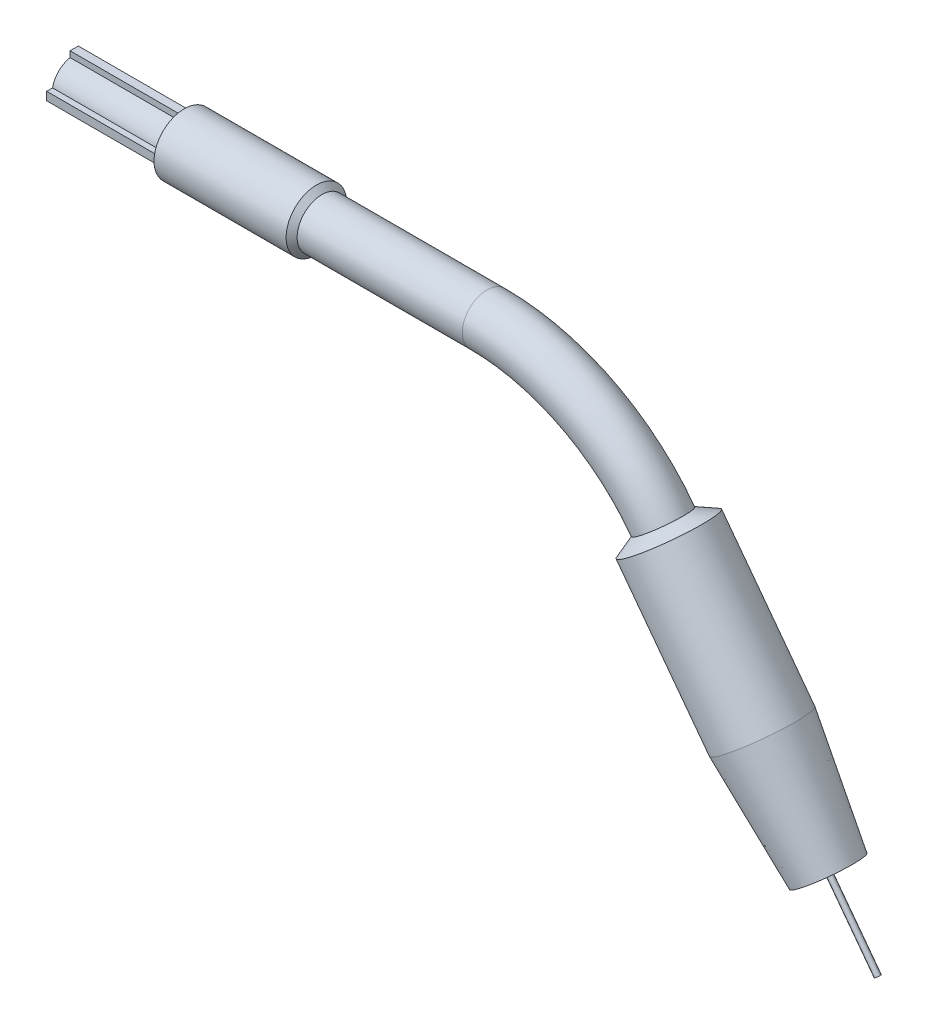
ISO-10303-21;
HEADER;
FILE_DESCRIPTION(('STEP AP214'),'2;1');
FILE_NAME('part.step','',(''),(''),'','','');
FILE_SCHEMA(('AUTOMOTIVE_DESIGN { 1 0 10303 214 1 1 1 1 }'));
ENDSEC;
DATA;
#1=APPLICATION_CONTEXT('core data for automotive mechanical design processes');
#2=APPLICATION_PROTOCOL_DEFINITION('international standard','automotive_design',2000,#1);
#3=PRODUCT_CONTEXT('',#1,'mechanical');
#4=PRODUCT('Part','Part','',(#3));
#5=PRODUCT_RELATED_PRODUCT_CATEGORY('part','',(#4));
#6=PRODUCT_DEFINITION_FORMATION('','',#4);
#7=PRODUCT_DEFINITION_CONTEXT('part definition',#1,'design');
#8=PRODUCT_DEFINITION('design','',#6,#7);
#9=PRODUCT_DEFINITION_SHAPE('','',#8);
#10=(LENGTH_UNIT() NAMED_UNIT(*) SI_UNIT(.MILLI.,.METRE.));
#11=(NAMED_UNIT(*) PLANE_ANGLE_UNIT() SI_UNIT($,.RADIAN.));
#12=(NAMED_UNIT(*) SI_UNIT($,.STERADIAN.) SOLID_ANGLE_UNIT());
#13=UNCERTAINTY_MEASURE_WITH_UNIT(LENGTH_MEASURE(1.E-05),#10,'distance_accuracy_value','');
#14=(GEOMETRIC_REPRESENTATION_CONTEXT(3) GLOBAL_UNCERTAINTY_ASSIGNED_CONTEXT((#13)) GLOBAL_UNIT_ASSIGNED_CONTEXT((#10,
#11,#12)) REPRESENTATION_CONTEXT('',''));
#15=CARTESIAN_POINT('',(0.,0.,0.));
#16=DIRECTION('',(0.,0.,1.));
#17=DIRECTION('',(1.,0.,0.));
#18=AXIS2_PLACEMENT_3D('',#15,#16,#17);
#19=CARTESIAN_POINT('',(0.,0.,0.));
#20=DIRECTION('',(1.,0.,0.));
#21=DIRECTION('',(0.,0.,-1.));
#22=AXIS2_PLACEMENT_3D('',#19,#20,#21);
#23=PLANE('',#22);
#24=DIRECTION('',(0.,0.,-1.));
#25=VECTOR('',#24,1.);
#26=CARTESIAN_POINT('',(0.,-0.749999999999654,0.));
#27=LINE('',#26,#25);
#28=CARTESIAN_POINT('',(0.,-0.749999999999654,-3.92905841137549));
#29=VERTEX_POINT('',#28);
#30=CARTESIAN_POINT('',(0.,-0.749999999999654,-5.00000000000044));
#31=VERTEX_POINT('',#30);
#32=EDGE_CURVE('E272',#29,#31,#27,.T.);
#33=ORIENTED_EDGE('',*,*,#32,.F.);
#34=CARTESIAN_POINT('',(0.,0.,0.));
#35=DIRECTION('',(1.,0.,0.));
#36=DIRECTION('',(0.,0.,-1.));
#37=AXIS2_PLACEMENT_3D('',#34,#35,#36);
#38=CIRCLE('',#37,4.);
#39=CARTESIAN_POINT('',(0.,-3.92905841137528,-0.750000000000784));
#40=VERTEX_POINT('',#39);
#41=EDGE_CURVE('E260',#40,#29,#38,.T.);
#42=ORIENTED_EDGE('',*,*,#41,.F.);
#43=DIRECTION('',(0.,-1.,0.));
#44=VECTOR('',#43,1.);
#45=CARTESIAN_POINT('',(0.,0.,-0.750000000000784));
#46=LINE('',#45,#44);
#47=CARTESIAN_POINT('',(0.,-5.00000000000009,-0.750000000000785));
#48=VERTEX_POINT('',#47);
#49=EDGE_CURVE('E269',#40,#48,#46,.T.);
#50=ORIENTED_EDGE('',*,*,#49,.T.);
#51=DIRECTION('',(0.,0.,1.));
#52=VECTOR('',#51,1.);
#53=CARTESIAN_POINT('',(0.,-5.00000000000009,0.));
#54=LINE('',#53,#52);
#55=CARTESIAN_POINT('',(0.,-5.00000000000009,0.749999999999215));
#56=VERTEX_POINT('',#55);
#57=EDGE_CURVE('E278',#48,#56,#54,.T.);
#58=ORIENTED_EDGE('',*,*,#57,.T.);
#59=DIRECTION('',(0.,-1.,0.));
#60=VECTOR('',#59,1.);
#61=CARTESIAN_POINT('',(0.,0.,0.749999999999216));
#62=LINE('',#61,#60);
#63=CARTESIAN_POINT('',(0.,-3.92905841137558,0.749999999999216));
#64=VERTEX_POINT('',#63);
#65=EDGE_CURVE('E280',#64,#56,#62,.T.);
#66=ORIENTED_EDGE('',*,*,#65,.F.);
#67=CARTESIAN_POINT('',(0.,-0.750000000000439,3.92905841137534));
#68=VERTEX_POINT('',#67);
#69=EDGE_CURVE('E275',#68,#64,#38,.T.);
#70=ORIENTED_EDGE('',*,*,#69,.F.);
#71=DIRECTION('',(0.,0.,1.));
#72=VECTOR('',#71,1.);
#73=CARTESIAN_POINT('',(0.,-0.750000000000438,0.));
#74=LINE('',#73,#72);
#75=CARTESIAN_POINT('',(0.,-0.750000000000439,4.99999999999965));
#76=VERTEX_POINT('',#75);
#77=EDGE_CURVE('E510',#68,#76,#74,.T.);
#78=ORIENTED_EDGE('',*,*,#77,.T.);
#79=DIRECTION('',(0.,1.,0.));
#80=VECTOR('',#79,1.);
#81=CARTESIAN_POINT('',(0.,0.,4.99999999999965));
#82=LINE('',#81,#80);
#83=CARTESIAN_POINT('',(0.,0.749999999999561,4.99999999999965));
#84=VERTEX_POINT('',#83);
#85=EDGE_CURVE('E507',#76,#84,#82,.T.);
#86=ORIENTED_EDGE('',*,*,#85,.T.);
#87=DIRECTION('',(0.,0.,1.));
#88=VECTOR('',#87,1.);
#89=CARTESIAN_POINT('',(0.,0.749999999999562,0.));
#90=LINE('',#89,#88);
#91=CARTESIAN_POINT('',(0.,0.749999999999561,3.92905841137551));
#92=VERTEX_POINT('',#91);
#93=EDGE_CURVE('E504',#92,#84,#90,.T.);
#94=ORIENTED_EDGE('',*,*,#93,.F.);
#95=CARTESIAN_POINT('',(0.,3.92905841137543,0.75));
#96=VERTEX_POINT('',#95);
#97=EDGE_CURVE('E495',#96,#92,#38,.T.);
#98=ORIENTED_EDGE('',*,*,#97,.F.);
#99=DIRECTION('',(0.,1.,0.));
#100=VECTOR('',#99,1.);
#101=CARTESIAN_POINT('',(0.,0.,0.75));
#102=LINE('',#101,#100);
#103=CARTESIAN_POINT('',(0.,5.,0.75));
#104=VERTEX_POINT('',#103);
#105=EDGE_CURVE('E501',#96,#104,#102,.T.);
#106=ORIENTED_EDGE('',*,*,#105,.T.);
#107=DIRECTION('',(0.,0.,-1.));
#108=VECTOR('',#107,1.);
#109=CARTESIAN_POINT('',(0.,5.,0.));
#110=LINE('',#109,#108);
#111=CARTESIAN_POINT('',(0.,5.,-0.75));
#112=VERTEX_POINT('',#111);
#113=EDGE_CURVE('E498',#104,#112,#110,.T.);
#114=ORIENTED_EDGE('',*,*,#113,.T.);
#115=DIRECTION('',(0.,1.,0.));
#116=VECTOR('',#115,1.);
#117=CARTESIAN_POINT('',(0.,0.,-0.75));
#118=LINE('',#117,#116);
#119=CARTESIAN_POINT('',(0.,3.92905841137543,-0.75));
#120=VERTEX_POINT('',#119);
#121=EDGE_CURVE('E494',#120,#112,#118,.T.);
#122=ORIENTED_EDGE('',*,*,#121,.F.);
#123=CARTESIAN_POINT('',(0.,0.750000000000346,-3.92905841137536));
#124=VERTEX_POINT('',#123);
#125=EDGE_CURVE('E276',#124,#120,#38,.T.);
#126=ORIENTED_EDGE('',*,*,#125,.F.);
#127=DIRECTION('',(0.,0.,-1.));
#128=VECTOR('',#127,1.);
#129=CARTESIAN_POINT('',(0.,0.750000000000346,0.));
#130=LINE('',#129,#128);
#131=CARTESIAN_POINT('',(0.,0.750000000000346,-5.00000000000044));
#132=VERTEX_POINT('',#131);
#133=EDGE_CURVE('E445',#124,#132,#130,.T.);
#134=ORIENTED_EDGE('',*,*,#133,.T.);
#135=DIRECTION('',(0.,-1.,0.));
#136=VECTOR('',#135,1.);
#137=CARTESIAN_POINT('',(0.,0.,-5.00000000000044));
#138=LINE('',#137,#136);
#139=EDGE_CURVE('E452',#132,#31,#138,.T.);
#140=ORIENTED_EDGE('',*,*,#139,.T.);
#141=EDGE_LOOP('',(#33,#42,#50,#58,#66,#70,#78,#86,#94,#98,#106,#114,#122,#126,#134,#140));
#142=FACE_BOUND('',#141,.T.);
#143=ADVANCED_FACE('F184',(#142),#23,.F.);
#144=CARTESIAN_POINT('',(20.,-0.749999999999654,0.));
#145=DIRECTION('',(0.,1.,0.));
#146=DIRECTION('',(0.,0.,1.));
#147=AXIS2_PLACEMENT_3D('',#144,#145,#146);
#148=PLANE('',#147);
#149=ORIENTED_EDGE('',*,*,#32,.T.);
#150=DIRECTION('',(-1.,0.,0.));
#151=VECTOR('',#150,1.);
#152=CARTESIAN_POINT('',(20.,-0.749999999999654,-5.00000000000044));
#153=LINE('',#152,#151);
#154=CARTESIAN_POINT('',(20.,-0.749999999999654,-5.00000000000044));
#155=VERTEX_POINT('',#154);
#156=EDGE_CURVE('E459',#155,#31,#153,.T.);
#157=ORIENTED_EDGE('',*,*,#156,.F.);
#158=DIRECTION('',(0.,0.,-1.));
#159=VECTOR('',#158,1.);
#160=CARTESIAN_POINT('',(20.,-0.749999999999654,0.));
#161=LINE('',#160,#159);
#162=CARTESIAN_POINT('',(20.,-0.749999999999654,-3.92905841137549));
#163=VERTEX_POINT('',#162);
#164=EDGE_CURVE('E441',#163,#155,#161,.T.);
#165=ORIENTED_EDGE('',*,*,#164,.F.);
#166=DIRECTION('',(-1.,0.,0.));
#167=VECTOR('',#166,1.);
#168=CARTESIAN_POINT('',(20.,-0.749999999999654,-3.92905841137549));
#169=LINE('',#168,#167);
#170=EDGE_CURVE('E312',#163,#29,#169,.T.);
#171=ORIENTED_EDGE('',*,*,#170,.T.);
#172=EDGE_LOOP('',(#149,#157,#165,#171));
#173=FACE_BOUND('',#172,.T.);
#174=ADVANCED_FACE('F339',(#173),#148,.F.);
#175=CARTESIAN_POINT('',(20.,0.,-5.00000000000044));
#176=DIRECTION('',(0.,0.,-1.));
#177=DIRECTION('',(-1.,0.,0.));
#178=AXIS2_PLACEMENT_3D('',#175,#176,#177);
#179=PLANE('',#178);
#180=ORIENTED_EDGE('',*,*,#139,.F.);
#181=DIRECTION('',(-1.,0.,0.));
#182=VECTOR('',#181,1.);
#183=CARTESIAN_POINT('',(20.,0.750000000000346,-5.00000000000044));
#184=LINE('',#183,#182);
#185=CARTESIAN_POINT('',(20.,0.750000000000346,-5.00000000000044));
#186=VERTEX_POINT('',#185);
#187=EDGE_CURVE('E457',#186,#132,#184,.T.);
#188=ORIENTED_EDGE('',*,*,#187,.F.);
#189=DIRECTION('',(0.,-1.,0.));
#190=VECTOR('',#189,1.);
#191=CARTESIAN_POINT('',(20.,0.,-5.00000000000044));
#192=LINE('',#191,#190);
#193=EDGE_CURVE('E444',#186,#155,#192,.T.);
#194=ORIENTED_EDGE('',*,*,#193,.T.);
#195=ORIENTED_EDGE('',*,*,#156,.T.);
#196=EDGE_LOOP('',(#180,#188,#194,#195));
#197=FACE_BOUND('',#196,.T.);
#198=ADVANCED_FACE('F341',(#197),#179,.T.);
#199=CARTESIAN_POINT('',(20.,0.750000000000346,0.));
#200=DIRECTION('',(0.,1.,0.));
#201=DIRECTION('',(0.,0.,1.));
#202=AXIS2_PLACEMENT_3D('',#199,#200,#201);
#203=PLANE('',#202);
#204=ORIENTED_EDGE('',*,*,#133,.F.);
#205=DIRECTION('',(-1.,0.,0.));
#206=VECTOR('',#205,1.);
#207=CARTESIAN_POINT('',(20.,0.750000000000346,-3.92905841137536));
#208=LINE('',#207,#206);
#209=CARTESIAN_POINT('',(20.,0.750000000000346,-3.92905841137536));
#210=VERTEX_POINT('',#209);
#211=EDGE_CURVE('E202',#210,#124,#208,.T.);
#212=ORIENTED_EDGE('',*,*,#211,.F.);
#213=DIRECTION('',(0.,0.,-1.));
#214=VECTOR('',#213,1.);
#215=CARTESIAN_POINT('',(20.,0.750000000000346,0.));
#216=LINE('',#215,#214);
#217=EDGE_CURVE('E448',#210,#186,#216,.T.);
#218=ORIENTED_EDGE('',*,*,#217,.T.);
#219=ORIENTED_EDGE('',*,*,#187,.T.);
#220=EDGE_LOOP('',(#204,#212,#218,#219));
#221=FACE_BOUND('',#220,.T.);
#222=ADVANCED_FACE('F348',(#221),#203,.T.);
#223=CARTESIAN_POINT('',(20.,5.,0.));
#224=DIRECTION('',(0.,1.,0.));
#225=DIRECTION('',(0.,0.,1.));
#226=AXIS2_PLACEMENT_3D('',#223,#224,#225);
#227=PLANE('',#226);
#228=ORIENTED_EDGE('',*,*,#113,.F.);
#229=DIRECTION('',(-1.,0.,0.));
#230=VECTOR('',#229,1.);
#231=CARTESIAN_POINT('',(20.,5.,0.75));
#232=LINE('',#231,#230);
#233=CARTESIAN_POINT('',(20.,5.,0.75));
#234=VERTEX_POINT('',#233);
#235=EDGE_CURVE('E301',#234,#104,#232,.T.);
#236=ORIENTED_EDGE('',*,*,#235,.F.);
#237=DIRECTION('',(0.,0.,-1.));
#238=VECTOR('',#237,1.);
#239=CARTESIAN_POINT('',(20.,5.,0.));
#240=LINE('',#239,#238);
#241=CARTESIAN_POINT('',(20.,5.,-0.75));
#242=VERTEX_POINT('',#241);
#243=EDGE_CURVE('E470',#234,#242,#240,.T.);
#244=ORIENTED_EDGE('',*,*,#243,.T.);
#245=DIRECTION('',(-1.,0.,0.));
#246=VECTOR('',#245,1.);
#247=CARTESIAN_POINT('',(20.,5.,-0.75));
#248=LINE('',#247,#246);
#249=EDGE_CURVE('E303',#242,#112,#248,.T.);
#250=ORIENTED_EDGE('',*,*,#249,.T.);
#251=EDGE_LOOP('',(#228,#236,#244,#250));
#252=FACE_BOUND('',#251,.T.);
#253=ADVANCED_FACE('F386',(#252),#227,.T.);
#254=CARTESIAN_POINT('',(20.,0.,0.75));
#255=DIRECTION('',(0.,0.,1.));
#256=DIRECTION('',(1.,0.,0.));
#257=AXIS2_PLACEMENT_3D('',#254,#255,#256);
#258=PLANE('',#257);
#259=ORIENTED_EDGE('',*,*,#105,.F.);
#260=DIRECTION('',(-1.,0.,0.));
#261=VECTOR('',#260,1.);
#262=CARTESIAN_POINT('',(20.,3.92905841137543,0.75));
#263=LINE('',#262,#261);
#264=CARTESIAN_POINT('',(20.,3.92905841137543,0.75));
#265=VERTEX_POINT('',#264);
#266=EDGE_CURVE('E299',#265,#96,#263,.T.);
#267=ORIENTED_EDGE('',*,*,#266,.F.);
#268=DIRECTION('',(0.,1.,0.));
#269=VECTOR('',#268,1.);
#270=CARTESIAN_POINT('',(20.,0.,0.75));
#271=LINE('',#270,#269);
#272=EDGE_CURVE('E473',#265,#234,#271,.T.);
#273=ORIENTED_EDGE('',*,*,#272,.T.);
#274=ORIENTED_EDGE('',*,*,#235,.T.);
#275=EDGE_LOOP('',(#259,#267,#273,#274));
#276=FACE_BOUND('',#275,.T.);
#277=ADVANCED_FACE('F383',(#276),#258,.T.);
#278=CARTESIAN_POINT('',(20.,0.,0.));
#279=DIRECTION('',(-1.,0.,0.));
#280=DIRECTION('',(0.,0.,1.));
#281=AXIS2_PLACEMENT_3D('',#278,#279,#280);
#282=CYLINDRICAL_SURFACE('',#281,4.);
#283=ORIENTED_EDGE('',*,*,#97,.T.);
#284=DIRECTION('',(-1.,0.,0.));
#285=VECTOR('',#284,1.);
#286=CARTESIAN_POINT('',(20.,0.749999999999561,3.92905841137551));
#287=LINE('',#286,#285);
#288=CARTESIAN_POINT('',(20.,0.749999999999561,3.92905841137551));
#289=VERTEX_POINT('',#288);
#290=EDGE_CURVE('E296',#289,#92,#287,.T.);
#291=ORIENTED_EDGE('',*,*,#290,.F.);
#292=CARTESIAN_POINT('',(20.,0.,0.));
#293=DIRECTION('',(1.,0.,0.));
#294=DIRECTION('',(0.,0.,-1.));
#295=AXIS2_PLACEMENT_3D('',#292,#293,#294);
#296=CIRCLE('',#295,4.);
#297=EDGE_CURVE('E467',#265,#289,#296,.T.);
#298=ORIENTED_EDGE('',*,*,#297,.F.);
#299=ORIENTED_EDGE('',*,*,#266,.T.);
#300=EDGE_LOOP('',(#283,#291,#298,#299));
#301=FACE_BOUND('',#300,.T.);
#302=ADVANCED_FACE('F381',(#301),#282,.T.);
#303=CARTESIAN_POINT('',(20.,0.749999999999562,0.));
#304=DIRECTION('',(0.,-1.,0.));
#305=DIRECTION('',(0.,0.,-1.));
#306=AXIS2_PLACEMENT_3D('',#303,#304,#305);
#307=PLANE('',#306);
#308=ORIENTED_EDGE('',*,*,#93,.T.);
#309=DIRECTION('',(-1.,0.,0.));
#310=VECTOR('',#309,1.);
#311=CARTESIAN_POINT('',(20.,0.749999999999561,4.99999999999965));
#312=LINE('',#311,#310);
#313=CARTESIAN_POINT('',(20.,0.749999999999561,4.99999999999965));
#314=VERTEX_POINT('',#313);
#315=EDGE_CURVE('E294',#314,#84,#312,.T.);
#316=ORIENTED_EDGE('',*,*,#315,.F.);
#317=DIRECTION('',(0.,0.,1.));
#318=VECTOR('',#317,1.);
#319=CARTESIAN_POINT('',(20.,0.749999999999562,0.));
#320=LINE('',#319,#318);
#321=EDGE_CURVE('E476',#289,#314,#320,.T.);
#322=ORIENTED_EDGE('',*,*,#321,.F.);
#323=ORIENTED_EDGE('',*,*,#290,.T.);
#324=EDGE_LOOP('',(#308,#316,#322,#323));
#325=FACE_BOUND('',#324,.T.);
#326=ADVANCED_FACE('F377',(#325),#307,.F.);
#327=CARTESIAN_POINT('',(20.,0.,4.99999999999965));
#328=DIRECTION('',(0.,0.,1.));
#329=DIRECTION('',(1.,0.,0.));
#330=AXIS2_PLACEMENT_3D('',#327,#328,#329);
#331=PLANE('',#330);
#332=ORIENTED_EDGE('',*,*,#85,.F.);
#333=DIRECTION('',(-1.,0.,0.));
#334=VECTOR('',#333,1.);
#335=CARTESIAN_POINT('',(20.,-0.750000000000439,4.99999999999965));
#336=LINE('',#335,#334);
#337=CARTESIAN_POINT('',(20.,-0.750000000000439,4.99999999999965));
#338=VERTEX_POINT('',#337);
#339=EDGE_CURVE('E292',#338,#76,#336,.T.);
#340=ORIENTED_EDGE('',*,*,#339,.F.);
#341=DIRECTION('',(0.,1.,0.));
#342=VECTOR('',#341,1.);
#343=CARTESIAN_POINT('',(20.,0.,4.99999999999965));
#344=LINE('',#343,#342);
#345=EDGE_CURVE('E479',#338,#314,#344,.T.);
#346=ORIENTED_EDGE('',*,*,#345,.T.);
#347=ORIENTED_EDGE('',*,*,#315,.T.);
#348=EDGE_LOOP('',(#332,#340,#346,#347));
#349=FACE_BOUND('',#348,.T.);
#350=ADVANCED_FACE('F373',(#349),#331,.T.);
#351=CARTESIAN_POINT('',(20.,-0.750000000000438,0.));
#352=DIRECTION('',(0.,-1.,0.));
#353=DIRECTION('',(0.,0.,-1.));
#354=AXIS2_PLACEMENT_3D('',#351,#352,#353);
#355=PLANE('',#354);
#356=ORIENTED_EDGE('',*,*,#77,.F.);
#357=DIRECTION('',(-1.,0.,0.));
#358=VECTOR('',#357,1.);
#359=CARTESIAN_POINT('',(20.,-0.750000000000439,3.92905841137534));
#360=LINE('',#359,#358);
#361=CARTESIAN_POINT('',(20.,-0.750000000000439,3.92905841137534));
#362=VERTEX_POINT('',#361);
#363=EDGE_CURVE('E290',#362,#68,#360,.T.);
#364=ORIENTED_EDGE('',*,*,#363,.F.);
#365=DIRECTION('',(0.,0.,1.));
#366=VECTOR('',#365,1.);
#367=CARTESIAN_POINT('',(20.,-0.750000000000438,0.));
#368=LINE('',#367,#366);
#369=EDGE_CURVE('E482',#362,#338,#368,.T.);
#370=ORIENTED_EDGE('',*,*,#369,.T.);
#371=ORIENTED_EDGE('',*,*,#339,.T.);
#372=EDGE_LOOP('',(#356,#364,#370,#371));
#373=FACE_BOUND('',#372,.T.);
#374=ADVANCED_FACE('F370',(#373),#355,.T.);
#375=ORIENTED_EDGE('',*,*,#69,.T.);
#376=DIRECTION('',(-1.,0.,0.));
#377=VECTOR('',#376,1.);
#378=CARTESIAN_POINT('',(20.,-3.92905841137558,0.749999999999216));
#379=LINE('',#378,#377);
#380=CARTESIAN_POINT('',(20.,-3.92905841137558,0.749999999999216));
#381=VERTEX_POINT('',#380);
#382=EDGE_CURVE('E287',#381,#64,#379,.T.);
#383=ORIENTED_EDGE('',*,*,#382,.F.);
#384=EDGE_CURVE('E485',#362,#381,#296,.T.);
#385=ORIENTED_EDGE('',*,*,#384,.F.);
#386=ORIENTED_EDGE('',*,*,#363,.T.);
#387=EDGE_LOOP('',(#375,#383,#385,#386));
#388=FACE_BOUND('',#387,.T.);
#389=ADVANCED_FACE('F358',(#388),#282,.T.);
#390=CARTESIAN_POINT('',(20.,0.,0.749999999999216));
#391=DIRECTION('',(0.,0.,-1.));
#392=DIRECTION('',(0.,1.,0.));
#393=AXIS2_PLACEMENT_3D('',#390,#391,#392);
#394=PLANE('',#393);
#395=ORIENTED_EDGE('',*,*,#65,.T.);
#396=DIRECTION('',(-1.,0.,0.));
#397=VECTOR('',#396,1.);
#398=CARTESIAN_POINT('',(20.,-5.00000000000009,0.749999999999215));
#399=LINE('',#398,#397);
#400=CARTESIAN_POINT('',(20.,-5.00000000000009,0.749999999999215));
#401=VERTEX_POINT('',#400);
#402=EDGE_CURVE('E285',#401,#56,#399,.T.);
#403=ORIENTED_EDGE('',*,*,#402,.F.);
#404=DIRECTION('',(0.,-1.,0.));
#405=VECTOR('',#404,1.);
#406=CARTESIAN_POINT('',(20.,0.,0.749999999999216));
#407=LINE('',#406,#405);
#408=EDGE_CURVE('E486',#381,#401,#407,.T.);
#409=ORIENTED_EDGE('',*,*,#408,.F.);
#410=ORIENTED_EDGE('',*,*,#382,.T.);
#411=EDGE_LOOP('',(#395,#403,#409,#410));
#412=FACE_BOUND('',#411,.T.);
#413=ADVANCED_FACE('F365',(#412),#394,.F.);
#414=CARTESIAN_POINT('',(20.,-5.00000000000009,0.));
#415=DIRECTION('',(0.,-1.,0.));
#416=DIRECTION('',(0.,0.,-1.));
#417=AXIS2_PLACEMENT_3D('',#414,#415,#416);
#418=PLANE('',#417);
#419=ORIENTED_EDGE('',*,*,#57,.F.);
#420=DIRECTION('',(-1.,0.,0.));
#421=VECTOR('',#420,1.);
#422=CARTESIAN_POINT('',(20.,-5.00000000000009,-0.750000000000785));
#423=LINE('',#422,#421);
#424=CARTESIAN_POINT('',(20.,-5.00000000000009,-0.750000000000785));
#425=VERTEX_POINT('',#424);
#426=EDGE_CURVE('E249',#425,#48,#423,.T.);
#427=ORIENTED_EDGE('',*,*,#426,.F.);
#428=DIRECTION('',(0.,0.,1.));
#429=VECTOR('',#428,1.);
#430=CARTESIAN_POINT('',(20.,-5.00000000000009,0.));
#431=LINE('',#430,#429);
#432=EDGE_CURVE('E489',#425,#401,#431,.T.);
#433=ORIENTED_EDGE('',*,*,#432,.T.);
#434=ORIENTED_EDGE('',*,*,#402,.T.);
#435=EDGE_LOOP('',(#419,#427,#433,#434));
#436=FACE_BOUND('',#435,.T.);
#437=ADVANCED_FACE('F362',(#436),#418,.T.);
#438=CARTESIAN_POINT('',(20.,0.,-0.750000000000784));
#439=DIRECTION('',(0.,0.,-1.));
#440=DIRECTION('',(0.,1.,0.));
#441=AXIS2_PLACEMENT_3D('',#438,#439,#440);
#442=PLANE('',#441);
#443=ORIENTED_EDGE('',*,*,#49,.F.);
#444=DIRECTION('',(-1.,0.,0.));
#445=VECTOR('',#444,1.);
#446=CARTESIAN_POINT('',(20.,-3.92905841137528,-0.750000000000784));
#447=LINE('',#446,#445);
#448=CARTESIAN_POINT('',(20.,-3.92905841137528,-0.750000000000784));
#449=VERTEX_POINT('',#448);
#450=EDGE_CURVE('E256',#449,#40,#447,.T.);
#451=ORIENTED_EDGE('',*,*,#450,.F.);
#452=DIRECTION('',(0.,-1.,0.));
#453=VECTOR('',#452,1.);
#454=CARTESIAN_POINT('',(20.,0.,-0.750000000000784));
#455=LINE('',#454,#453);
#456=EDGE_CURVE('E492',#449,#425,#455,.T.);
#457=ORIENTED_EDGE('',*,*,#456,.T.);
#458=ORIENTED_EDGE('',*,*,#426,.T.);
#459=EDGE_LOOP('',(#443,#451,#457,#458));
#460=FACE_BOUND('',#459,.T.);
#461=ADVANCED_FACE('F277',(#460),#442,.T.);
#462=CARTESIAN_POINT('',(20.,0.,-0.75));
#463=DIRECTION('',(0.,0.,1.));
#464=DIRECTION('',(1.,0.,0.));
#465=AXIS2_PLACEMENT_3D('',#462,#463,#464);
#466=PLANE('',#465);
#467=ORIENTED_EDGE('',*,*,#121,.T.);
#468=ORIENTED_EDGE('',*,*,#249,.F.);
#469=DIRECTION('',(0.,1.,0.));
#470=VECTOR('',#469,1.);
#471=CARTESIAN_POINT('',(20.,0.,-0.75));
#472=LINE('',#471,#470);
#473=CARTESIAN_POINT('',(20.,3.92905841137543,-0.75));
#474=VERTEX_POINT('',#473);
#475=EDGE_CURVE('E466',#474,#242,#472,.T.);
#476=ORIENTED_EDGE('',*,*,#475,.F.);
#477=DIRECTION('',(-1.,0.,0.));
#478=VECTOR('',#477,1.);
#479=CARTESIAN_POINT('',(20.,3.92905841137543,-0.75));
#480=LINE('',#479,#478);
#481=EDGE_CURVE('E305',#474,#120,#480,.T.);
#482=ORIENTED_EDGE('',*,*,#481,.T.);
#483=EDGE_LOOP('',(#467,#468,#476,#482));
#484=FACE_BOUND('',#483,.T.);
#485=ADVANCED_FACE('F361',(#484),#466,.F.);
#486=ORIENTED_EDGE('',*,*,#125,.T.);
#487=ORIENTED_EDGE('',*,*,#481,.F.);
#488=EDGE_CURVE('E273',#210,#474,#296,.T.);
#489=ORIENTED_EDGE('',*,*,#488,.F.);
#490=ORIENTED_EDGE('',*,*,#211,.T.);
#491=EDGE_LOOP('',(#486,#487,#489,#490));
#492=FACE_BOUND('',#491,.T.);
#493=ADVANCED_FACE('F357',(#492),#282,.T.);
#494=ORIENTED_EDGE('',*,*,#41,.T.);
#495=ORIENTED_EDGE('',*,*,#170,.F.);
#496=EDGE_CURVE('E264',#449,#163,#296,.T.);
#497=ORIENTED_EDGE('',*,*,#496,.F.);
#498=ORIENTED_EDGE('',*,*,#450,.T.);
#499=EDGE_LOOP('',(#494,#495,#497,#498));
#500=FACE_BOUND('',#499,.T.);
#501=ADVANCED_FACE('F258',(#500),#282,.T.);
#502=CARTESIAN_POINT('',(20.,0.,0.));
#503=DIRECTION('',(1.,0.,0.));
#504=DIRECTION('',(0.,0.,-1.));
#505=AXIS2_PLACEMENT_3D('',#502,#503,#504);
#506=PLANE('',#505);
#507=CARTESIAN_POINT('',(20.,0.,0.));
#508=DIRECTION('',(1.,0.,0.));
#509=DIRECTION('',(0.,0.,-1.));
#510=AXIS2_PLACEMENT_3D('',#507,#508,#509);
#511=CIRCLE('',#510,5.5);
#512=CARTESIAN_POINT('',(20.,0.,-5.5));
#513=VERTEX_POINT('',#512);
#514=EDGE_CURVE('E431',#513,#513,#511,.T.);
#515=ORIENTED_EDGE('',*,*,#514,.F.);
#516=EDGE_LOOP('',(#515));
#517=FACE_BOUND('',#516,.T.);
#518=ORIENTED_EDGE('',*,*,#456,.F.);
#519=ORIENTED_EDGE('',*,*,#496,.T.);
#520=ORIENTED_EDGE('',*,*,#164,.T.);
#521=ORIENTED_EDGE('',*,*,#193,.F.);
#522=ORIENTED_EDGE('',*,*,#217,.F.);
#523=ORIENTED_EDGE('',*,*,#488,.T.);
#524=ORIENTED_EDGE('',*,*,#475,.T.);
#525=ORIENTED_EDGE('',*,*,#243,.F.);
#526=ORIENTED_EDGE('',*,*,#272,.F.);
#527=ORIENTED_EDGE('',*,*,#297,.T.);
#528=ORIENTED_EDGE('',*,*,#321,.T.);
#529=ORIENTED_EDGE('',*,*,#345,.F.);
#530=ORIENTED_EDGE('',*,*,#369,.F.);
#531=ORIENTED_EDGE('',*,*,#384,.T.);
#532=ORIENTED_EDGE('',*,*,#408,.T.);
#533=ORIENTED_EDGE('',*,*,#432,.F.);
#534=EDGE_LOOP('',(#518,#519,#520,#521,#522,#523,#524,#525,#526,#527,#528,#529,#530,#531,#532,#533));
#535=FACE_BOUND('',#534,.T.);
#536=ADVANCED_FACE('F356',(#517,#535),#506,.F.);
#537=CARTESIAN_POINT('',(45.,0.,0.));
#538=DIRECTION('',(-1.,0.,0.));
#539=DIRECTION('',(0.,0.,1.));
#540=AXIS2_PLACEMENT_3D('',#537,#538,#539);
#541=CYLINDRICAL_SURFACE('',#540,5.5);
#542=CARTESIAN_POINT('',(44.,0.,0.));
#543=DIRECTION('',(1.,0.,0.));
#544=DIRECTION('',(0.,0.,-1.));
#545=AXIS2_PLACEMENT_3D('',#542,#543,#544);
#546=CIRCLE('',#545,5.5);
#547=CARTESIAN_POINT('',(44.,0.,-5.5));
#548=VERTEX_POINT('',#547);
#549=EDGE_CURVE('E311',#548,#548,#546,.F.);
#550=ORIENTED_EDGE('',*,*,#549,.T.);
#551=EDGE_LOOP('',(#550));
#552=FACE_BOUND('',#551,.T.);
#553=ORIENTED_EDGE('',*,*,#514,.T.);
#554=EDGE_LOOP('',(#553));
#555=FACE_BOUND('',#554,.T.);
#556=ADVANCED_FACE('F402',(#552,#555),#541,.T.);
#557=CARTESIAN_POINT('',(45.,0.,0.));
#558=DIRECTION('',(-1.,0.,0.));
#559=DIRECTION('',(0.,0.,1.));
#560=AXIS2_PLACEMENT_3D('',#557,#558,#559);
#561=CONICAL_SURFACE('',#560,4.5,0.785398163397446);
#562=ORIENTED_EDGE('',*,*,#549,.F.);
#563=EDGE_LOOP('',(#562));
#564=FACE_BOUND('',#563,.T.);
#565=CARTESIAN_POINT('',(45.,0.,0.));
#566=DIRECTION('',(1.,0.,0.));
#567=DIRECTION('',(0.,0.,-1.));
#568=AXIS2_PLACEMENT_3D('',#565,#566,#567);
#569=CIRCLE('',#568,4.5);
#570=CARTESIAN_POINT('',(45.,0.,-4.5));
#571=VERTEX_POINT('',#570);
#572=EDGE_CURVE('E308',#571,#571,#569,.T.);
#573=ORIENTED_EDGE('',*,*,#572,.F.);
#574=EDGE_LOOP('',(#573));
#575=FACE_BOUND('',#574,.T.);
#576=ADVANCED_FACE('F395',(#564,#575),#561,.T.);
#577=CARTESIAN_POINT('',(45.,0.,0.));
#578=DIRECTION('',(1.,0.,0.));
#579=DIRECTION('',(0.,0.,-1.));
#580=AXIS2_PLACEMENT_3D('',#577,#578,#579);
#581=CYLINDRICAL_SURFACE('',#580,4.5);
#582=CARTESIAN_POINT('',(75.,0.,0.));
#583=DIRECTION('',(1.,0.,0.));
#584=DIRECTION('',(0.,0.,-1.));
#585=AXIS2_PLACEMENT_3D('',#582,#583,#584);
#586=CIRCLE('',#585,4.5);
#587=CARTESIAN_POINT('',(75.,4.5,0.));
#588=VERTEX_POINT('',#587);
#589=EDGE_CURVE('E432',#588,#588,#586,.T.);
#590=ORIENTED_EDGE('',*,*,#589,.F.);
#591=EDGE_LOOP('',(#590));
#592=FACE_BOUND('',#591,.T.);
#593=ORIENTED_EDGE('',*,*,#572,.T.);
#594=EDGE_LOOP('',(#593));
#595=FACE_BOUND('',#594,.T.);
#596=ADVANCED_FACE('F401',(#592,#595),#581,.T.);
#597=CARTESIAN_POINT('',(75.,-40.,0.));
#598=DIRECTION('',(0.,0.,-1.));
#599=DIRECTION('',(-1.,0.,0.));
#600=AXIS2_PLACEMENT_3D('',#597,#598,#599);
#601=TOROIDAL_SURFACE('',#600,40.,4.5);
#602=CARTESIAN_POINT('',(107.,-16.,0.));
#603=DIRECTION('',(0.6,-0.8,0.));
#604=DIRECTION('',(0.,0.,-1.));
#605=AXIS2_PLACEMENT_3D('',#602,#603,#604);
#606=CIRCLE('',#605,4.5);
#607=CARTESIAN_POINT('',(110.6,-13.3,0.));
#608=VERTEX_POINT('',#607);
#609=EDGE_CURVE('E427',#608,#608,#606,.T.);
#610=CARTESIAN_POINT('',(75.,-40.,0.));
#611=DIRECTION('',(0.,0.,-1.));
#612=DIRECTION('',(-1.,0.,0.));
#613=AXIS2_PLACEMENT_3D('',#610,#611,#612);
#614=CIRCLE('',#613,44.5);
#615=EDGE_CURVE('',#588,#608,#614,.T.);
#616=ORIENTED_EDGE('',*,*,#589,.T.);
#617=ORIENTED_EDGE('',*,*,#609,.F.);
#618=ORIENTED_EDGE('',*,*,#615,.T.);
#619=ORIENTED_EDGE('',*,*,#615,.F.);
#620=EDGE_LOOP('',(#616,#618,#617,#619));
#621=FACE_BOUND('',#620,.T.);
#622=ADVANCED_FACE('F404',(#621),#601,.T.);
#623=CARTESIAN_POINT('',(107.,-16.,0.));
#624=DIRECTION('',(0.6,-0.8,0.));
#625=DIRECTION('',(0.8,0.6,0.));
#626=AXIS2_PLACEMENT_3D('',#623,#624,#625);
#627=CYLINDRICAL_SURFACE('',#626,7.50000000000002);
#628=CARTESIAN_POINT('',(125.,-40.,0.));
#629=DIRECTION('',(0.6,-0.8,0.));
#630=DIRECTION('',(0.8,0.6,0.));
#631=AXIS2_PLACEMENT_3D('',#628,#629,#630);
#632=CIRCLE('',#631,7.5);
#633=CARTESIAN_POINT('',(131.,-35.5,0.));
#634=VERTEX_POINT('',#633);
#635=EDGE_CURVE('E437',#634,#634,#632,.T.);
#636=ORIENTED_EDGE('',*,*,#635,.F.);
#637=EDGE_LOOP('',(#636));
#638=FACE_BOUND('',#637,.T.);
#639=CARTESIAN_POINT('',(108.039230484541,-17.3856406460551,0.));
#640=DIRECTION('',(0.600000000000001,-0.8,0.));
#641=DIRECTION('',(0.8,0.600000000000001,0.));
#642=AXIS2_PLACEMENT_3D('',#639,#640,#641);
#643=CIRCLE('',#642,7.50000000000002);
#644=CARTESIAN_POINT('',(114.039230484541,-12.8856406460551,0.));
#645=VERTEX_POINT('',#644);
#646=EDGE_CURVE('E315',#645,#645,#643,.T.);
#647=ORIENTED_EDGE('',*,*,#646,.T.);
#648=EDGE_LOOP('',(#647));
#649=FACE_BOUND('',#648,.T.);
#650=ADVANCED_FACE('F411',(#638,#649),#627,.T.);
#651=CARTESIAN_POINT('',(108.039230484541,-17.3856406460551,0.));
#652=DIRECTION('',(0.600000000000001,-0.8,0.));
#653=DIRECTION('',(0.8,0.600000000000001,0.));
#654=AXIS2_PLACEMENT_3D('',#651,#652,#653);
#655=CONICAL_SURFACE('',#654,7.50000000000002,1.0471975511966);
#656=ORIENTED_EDGE('',*,*,#609,.T.);
#657=EDGE_LOOP('',(#656));
#658=FACE_BOUND('',#657,.T.);
#659=ORIENTED_EDGE('',*,*,#646,.F.);
#660=EDGE_LOOP('',(#659));
#661=FACE_BOUND('',#660,.T.);
#662=ADVANCED_FACE('F405',(#658,#661),#655,.T.);
#663=CARTESIAN_POINT('',(125.,-40.,0.));
#664=DIRECTION('',(-0.6,0.8,0.));
#665=DIRECTION('',(-0.8,-0.6,0.));
#666=AXIS2_PLACEMENT_3D('',#663,#664,#665);
#667=CONICAL_SURFACE('',#666,7.5,0.0996686524911594);
#668=CARTESIAN_POINT('',(137.,-56.0000000000001,0.));
#669=DIRECTION('',(0.6,-0.8,0.));
#670=DIRECTION('',(0.8,0.6,0.));
#671=AXIS2_PLACEMENT_3D('',#668,#669,#670);
#672=CIRCLE('',#671,5.50000000000005);
#673=CARTESIAN_POINT('',(141.4,-52.7,0.));
#674=VERTEX_POINT('',#673);
#675=EDGE_CURVE('E889',#674,#674,#672,.T.);
#676=ORIENTED_EDGE('',*,*,#675,.F.);
#677=EDGE_LOOP('',(#676));
#678=FACE_BOUND('',#677,.T.);
#679=ORIENTED_EDGE('',*,*,#635,.T.);
#680=EDGE_LOOP('',(#679));
#681=FACE_BOUND('',#680,.T.);
#682=ADVANCED_FACE('F410',(#678,#681),#667,.T.);
#683=CARTESIAN_POINT('',(137.,-56.,0.));
#684=DIRECTION('',(0.6,-0.8,0.));
#685=DIRECTION('',(0.,0.,-1.));
#686=AXIS2_PLACEMENT_3D('',#683,#684,#685);
#687=PLANE('',#686);
#688=CARTESIAN_POINT('',(137.,-56.0000000000001,0.));
#689=DIRECTION('',(-0.6,0.8,0.));
#690=DIRECTION('',(-0.8,-0.6,0.));
#691=AXIS2_PLACEMENT_3D('',#688,#689,#690);
#692=CIRCLE('',#691,4.99750621894404);
#693=CARTESIAN_POINT('',(133.001995024845,-58.9985037313665,0.));
#694=VERTEX_POINT('',#693);
#695=EDGE_CURVE('E886',#694,#694,#692,.T.);
#696=ORIENTED_EDGE('',*,*,#695,.T.);
#697=EDGE_LOOP('',(#696));
#698=FACE_BOUND('',#697,.T.);
#699=ORIENTED_EDGE('',*,*,#675,.T.);
#700=EDGE_LOOP('',(#699));
#701=FACE_BOUND('',#700,.T.);
#702=ADVANCED_FACE('F419',(#698,#701),#687,.T.);
#703=CARTESIAN_POINT('',(125.,-40.,0.));
#704=DIRECTION('',(-0.6,0.8,0.));
#705=DIRECTION('',(-0.8,-0.6,0.));
#706=AXIS2_PLACEMENT_3D('',#703,#704,#705);
#707=CONICAL_SURFACE('',#706,6.99750621894399,0.0996686524911592);
#708=ORIENTED_EDGE('',*,*,#695,.F.);
#709=EDGE_LOOP('',(#708));
#710=FACE_BOUND('',#709,.T.);
#711=CARTESIAN_POINT('',(125.,-40.,0.));
#712=DIRECTION('',(-0.6,0.8,0.));
#713=DIRECTION('',(-0.8,-0.6,0.));
#714=AXIS2_PLACEMENT_3D('',#711,#712,#713);
#715=CIRCLE('',#714,6.99750621894398);
#716=CARTESIAN_POINT('',(119.401995024845,-44.1985037313664,0.));
#717=VERTEX_POINT('',#716);
#718=EDGE_CURVE('E882',#717,#717,#715,.T.);
#719=ORIENTED_EDGE('',*,*,#718,.T.);
#720=EDGE_LOOP('',(#719));
#721=FACE_BOUND('',#720,.T.);
#722=ADVANCED_FACE('F694',(#710,#721),#707,.F.);
#723=CARTESIAN_POINT('',(64.1999999999998,-85.6000000000002,0.));
#724=DIRECTION('',(-0.6,0.8,0.));
#725=DIRECTION('',(-0.8,-0.6,0.));
#726=AXIS2_PLACEMENT_3D('',#723,#724,#725);
#727=PLANE('',#726);
#728=CARTESIAN_POINT('',(125.,-40.,0.));
#729=DIRECTION('',(-0.6,0.8,0.));
#730=DIRECTION('',(-0.8,-0.6,0.));
#731=AXIS2_PLACEMENT_3D('',#728,#729,#730);
#732=CIRCLE('',#731,3.50000000000001);
#733=CARTESIAN_POINT('',(122.2,-42.1000000000001,0.));
#734=VERTEX_POINT('',#733);
#735=EDGE_CURVE('E318',#734,#734,#732,.F.);
#736=ORIENTED_EDGE('',*,*,#735,.F.);
#737=EDGE_LOOP('',(#736));
#738=FACE_BOUND('',#737,.T.);
#739=ORIENTED_EDGE('',*,*,#718,.F.);
#740=EDGE_LOOP('',(#739));
#741=FACE_BOUND('',#740,.T.);
#742=ADVANCED_FACE('F702',(#738,#741),#727,.F.);
#743=CARTESIAN_POINT('',(135.8,-54.4000000000001,0.));
#744=DIRECTION('',(0.6,-0.8,0.));
#745=DIRECTION('',(0.8,0.6,0.));
#746=AXIS2_PLACEMENT_3D('',#743,#744,#745);
#747=PLANE('',#746);
#748=CARTESIAN_POINT('',(135.8,-54.4000000000001,0.));
#749=DIRECTION('',(0.6,-0.8,0.));
#750=DIRECTION('',(0.8,0.6,0.));
#751=AXIS2_PLACEMENT_3D('',#748,#749,#750);
#752=CIRCLE('',#751,0.500000000000018);
#753=CARTESIAN_POINT('',(136.2,-54.1000000000001,0.));
#754=VERTEX_POINT('',#753);
#755=EDGE_CURVE('E188',#754,#754,#752,.F.);
#756=ORIENTED_EDGE('',*,*,#755,.T.);
#757=EDGE_LOOP('',(#756));
#758=FACE_BOUND('',#757,.T.);
#759=CARTESIAN_POINT('',(135.8,-54.4000000000001,0.));
#760=DIRECTION('',(0.6,-0.8,0.));
#761=DIRECTION('',(0.8,0.6,0.));
#762=AXIS2_PLACEMENT_3D('',#759,#760,#761);
#763=CIRCLE('',#762,1.07986711843403);
#764=CARTESIAN_POINT('',(136.663893694747,-53.7520797289397,0.));
#765=VERTEX_POINT('',#764);
#766=EDGE_CURVE('E194',#765,#765,#763,.T.);
#767=ORIENTED_EDGE('',*,*,#766,.T.);
#768=EDGE_LOOP('',(#767));
#769=FACE_BOUND('',#768,.T.);
#770=ADVANCED_FACE('F324',(#758,#769),#747,.T.);
#771=CARTESIAN_POINT('',(135.8,-54.4000000000001,0.));
#772=DIRECTION('',(-0.6,0.8,0.));
#773=DIRECTION('',(-0.8,-0.6,0.));
#774=AXIS2_PLACEMENT_3D('',#771,#772,#773);
#775=CONICAL_SURFACE('',#774,2.00000000000006,0.0831412318884374);
#776=CARTESIAN_POINT('',(135.249827287912,-53.666436383883,0.));
#777=DIRECTION('',(0.6,-0.8,0.));
#778=DIRECTION('',(0.8,0.6,0.));
#779=AXIS2_PLACEMENT_3D('',#776,#777,#778);
#780=CIRCLE('',#779,2.07641287667891);
#781=CARTESIAN_POINT('',(136.910957589255,-52.4205886578757,0.));
#782=VERTEX_POINT('',#781);
#783=EDGE_CURVE('E12',#782,#782,#780,.F.);
#784=ORIENTED_EDGE('',*,*,#783,.T.);
#785=EDGE_LOOP('',(#784));
#786=FACE_BOUND('',#785,.T.);
#787=ORIENTED_EDGE('',*,*,#735,.T.);
#788=EDGE_LOOP('',(#787));
#789=FACE_BOUND('',#788,.T.);
#790=ADVANCED_FACE('F328',(#786,#789),#775,.T.);
#791=CARTESIAN_POINT('',(135.2,-53.6000000000001,0.));
#792=DIRECTION('',(0.6,-0.8,0.));
#793=DIRECTION('',(0.8,0.6,0.));
#794=AXIS2_PLACEMENT_3D('',#791,#792,#793);
#795=TOROIDAL_SURFACE('',#794,1.07986711843403,1.);
#796=ORIENTED_EDGE('',*,*,#783,.F.);
#797=EDGE_LOOP('',(#796));
#798=FACE_BOUND('',#797,.T.);
#799=ORIENTED_EDGE('',*,*,#766,.F.);
#800=EDGE_LOOP('',(#799));
#801=FACE_BOUND('',#800,.T.);
#802=ADVANCED_FACE('F186',(#798,#801),#795,.T.);
#803=CARTESIAN_POINT('',(146.,-68.0000000000001,0.));
#804=DIRECTION('',(-0.599999999999999,0.800000000000001,0.));
#805=DIRECTION('',(-0.800000000000001,-0.599999999999999,0.));
#806=AXIS2_PLACEMENT_3D('',#803,#804,#805);
#807=PLANE('',#806);
#808=CARTESIAN_POINT('',(146.,-68.0000000000001,0.));
#809=DIRECTION('',(-0.599999999999999,0.800000000000001,0.));
#810=DIRECTION('',(-0.800000000000001,-0.599999999999999,0.));
#811=AXIS2_PLACEMENT_3D('',#808,#809,#810);
#812=CIRCLE('',#811,0.500000000000014);
#813=CARTESIAN_POINT('',(145.6,-68.3000000000001,0.));
#814=VERTEX_POINT('',#813);
#815=EDGE_CURVE('E880',#814,#814,#812,.T.);
#816=ORIENTED_EDGE('',*,*,#815,.F.);
#817=EDGE_LOOP('',(#816));
#818=FACE_BOUND('',#817,.T.);
#819=ADVANCED_FACE('F327',(#818),#807,.F.);
#820=CARTESIAN_POINT('',(125.,-40.,0.));
#821=DIRECTION('',(-0.599999999999999,0.800000000000001,0.));
#822=DIRECTION('',(-0.800000000000001,-0.599999999999999,0.));
#823=AXIS2_PLACEMENT_3D('',#820,#821,#822);
#824=CYLINDRICAL_SURFACE('',#823,0.500000000000018);
#825=ORIENTED_EDGE('',*,*,#755,.F.);
#826=EDGE_LOOP('',(#825));
#827=FACE_BOUND('',#826,.T.);
#828=ORIENTED_EDGE('',*,*,#815,.T.);
#829=EDGE_LOOP('',(#828));
#830=FACE_BOUND('',#829,.T.);
#831=ADVANCED_FACE('F334',(#827,#830),#824,.T.);
#832=CLOSED_SHELL('',(#143,#174,#198,#222,#253,#277,#302,#326,#350,#374,#389,#413,#437,#461,
#485,#493,#501,#536,#556,#576,#596,#622,#650,#662,#682,#702,#722,#742,#770,#790,#802,#819,#831));
#833=MANIFOLD_SOLID_BREP('B2',#832);
#834=ADVANCED_BREP_SHAPE_REPRESENTATION('',(#18,#833),#14);
#835=SHAPE_DEFINITION_REPRESENTATION(#9,#834);
ENDSEC;
END-ISO-10303-21;
